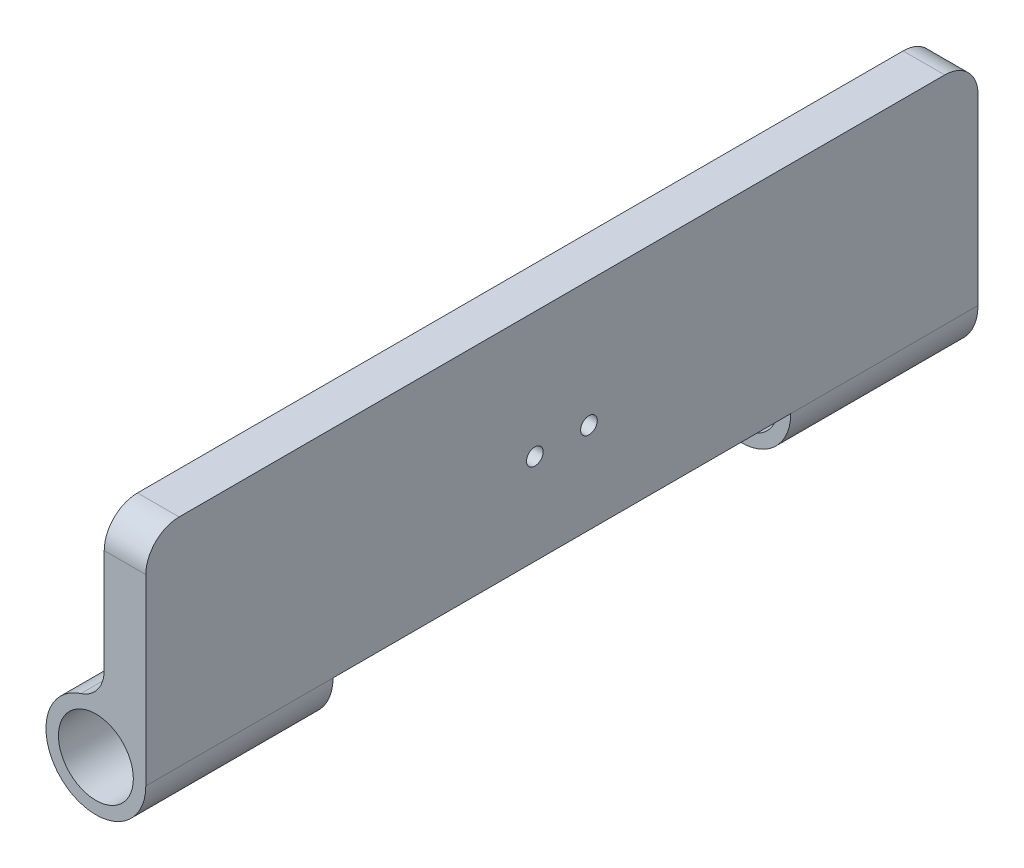
ISO-10303-21;
HEADER;
FILE_DESCRIPTION(('STEP AP214'),'2;1');
FILE_NAME('part.step','',(''),(''),'','','');
FILE_SCHEMA(('AUTOMOTIVE_DESIGN { 1 0 10303 214 1 1 1 1 }'));
ENDSEC;
DATA;
#1=APPLICATION_CONTEXT('core data for automotive mechanical design processes');
#2=APPLICATION_PROTOCOL_DEFINITION('international standard','automotive_design',2000,#1);
#3=PRODUCT_CONTEXT('',#1,'mechanical');
#4=PRODUCT('Part','Part','',(#3));
#5=PRODUCT_RELATED_PRODUCT_CATEGORY('part','',(#4));
#6=PRODUCT_DEFINITION_FORMATION('','',#4);
#7=PRODUCT_DEFINITION_CONTEXT('part definition',#1,'design');
#8=PRODUCT_DEFINITION('design','',#6,#7);
#9=PRODUCT_DEFINITION_SHAPE('','',#8);
#10=(LENGTH_UNIT() NAMED_UNIT(*) SI_UNIT(.MILLI.,.METRE.));
#11=(NAMED_UNIT(*) PLANE_ANGLE_UNIT() SI_UNIT($,.RADIAN.));
#12=(NAMED_UNIT(*) SI_UNIT($,.STERADIAN.) SOLID_ANGLE_UNIT());
#13=UNCERTAINTY_MEASURE_WITH_UNIT(LENGTH_MEASURE(1.E-05),#10,'distance_accuracy_value','');
#14=(GEOMETRIC_REPRESENTATION_CONTEXT(3) GLOBAL_UNCERTAINTY_ASSIGNED_CONTEXT((#13)) GLOBAL_UNIT_ASSIGNED_CONTEXT((#10,
#11,#12)) REPRESENTATION_CONTEXT('',''));
#15=CARTESIAN_POINT('',(0.,0.,0.));
#16=DIRECTION('',(0.,0.,1.));
#17=DIRECTION('',(1.,0.,0.));
#18=AXIS2_PLACEMENT_3D('',#15,#16,#17);
#19=CARTESIAN_POINT('',(-1.,40.,-76.4764045897474));
#20=DIRECTION('',(0.,0.,1.));
#21=DIRECTION('',(1.,0.,0.));
#22=AXIS2_PLACEMENT_3D('',#19,#20,#21);
#23=CYLINDRICAL_SURFACE('',#22,6.00000000000001);
#24=DIRECTION('',(0.,0.,1.));
#25=VECTOR('',#24,1.);
#26=CARTESIAN_POINT('',(5.,40.,-76.4764045897474));
#27=LINE('',#26,#25);
#28=CARTESIAN_POINT('',(5.,40.,-27.5));
#29=VERTEX_POINT('',#28);
#30=CARTESIAN_POINT('',(5.,40.,27.5));
#31=VERTEX_POINT('',#30);
#32=EDGE_CURVE('E155',#29,#31,#27,.T.);
#33=ORIENTED_EDGE('',*,*,#32,.T.);
#34=CARTESIAN_POINT('',(-1.,40.,27.5));
#35=DIRECTION('',(0.,0.,1.));
#36=DIRECTION('',(1.,0.,0.));
#37=AXIS2_PLACEMENT_3D('',#34,#35,#36);
#38=CIRCLE('',#37,6.);
#39=CARTESIAN_POINT('',(0.,45.9160797830996,27.5));
#40=VERTEX_POINT('',#39);
#41=EDGE_CURVE('E140',#31,#40,#38,.T.);
#42=ORIENTED_EDGE('',*,*,#41,.T.);
#43=DIRECTION('',(0.,0.,1.));
#44=VECTOR('',#43,1.);
#45=CARTESIAN_POINT('',(0.,45.9160797830996,-76.4764045897474));
#46=LINE('',#45,#44);
#47=CARTESIAN_POINT('',(0.,45.9160797830996,-27.5));
#48=VERTEX_POINT('',#47);
#49=EDGE_CURVE('E267',#48,#40,#46,.T.);
#50=ORIENTED_EDGE('',*,*,#49,.F.);
#51=CARTESIAN_POINT('',(-1.,40.,-27.5));
#52=DIRECTION('',(0.,0.,1.));
#53=DIRECTION('',(1.,0.,0.));
#54=AXIS2_PLACEMENT_3D('',#51,#52,#53);
#55=CIRCLE('',#54,6.);
#56=EDGE_CURVE('E164',#29,#48,#55,.T.);
#57=ORIENTED_EDGE('',*,*,#56,.F.);
#58=EDGE_LOOP('',(#33,#42,#50,#57));
#59=FACE_BOUND('',#58,.T.);
#60=ADVANCED_FACE('F45',(#59),#23,.F.);
#61=CARTESIAN_POINT('',(-1.,40.,50.));
#62=DIRECTION('',(0.,0.,-1.));
#63=DIRECTION('',(-1.,0.,0.));
#64=AXIS2_PLACEMENT_3D('',#61,#62,#63);
#65=CYLINDRICAL_SURFACE('',#64,6.);
#66=CARTESIAN_POINT('',(-2.8,45.7236352085017,-27.5));
#67=VERTEX_POINT('',#66);
#68=EDGE_CURVE('E190',#67,#29,#55,.T.);
#69=ORIENTED_EDGE('',*,*,#68,.F.);
#70=DIRECTION('',(0.,0.,-1.));
#71=VECTOR('',#70,1.);
#72=CARTESIAN_POINT('',(-2.8,45.7236352085017,50.));
#73=LINE('',#72,#71);
#74=CARTESIAN_POINT('',(-2.8,45.7236352085017,-50.));
#75=VERTEX_POINT('',#74);
#76=EDGE_CURVE('E217',#67,#75,#73,.T.);
#77=ORIENTED_EDGE('',*,*,#76,.T.);
#78=CARTESIAN_POINT('',(-1.,40.,-50.));
#79=DIRECTION('',(0.,0.,1.));
#80=DIRECTION('',(1.,0.,0.));
#81=AXIS2_PLACEMENT_3D('',#78,#79,#80);
#82=CIRCLE('',#81,6.);
#83=CARTESIAN_POINT('',(5.,40.,-50.));
#84=VERTEX_POINT('',#83);
#85=EDGE_CURVE('E180',#75,#84,#82,.T.);
#86=ORIENTED_EDGE('',*,*,#85,.T.);
#87=EDGE_CURVE('E166',#84,#29,#27,.T.);
#88=ORIENTED_EDGE('',*,*,#87,.T.);
#89=EDGE_LOOP('',(#69,#77,#86,#88));
#90=FACE_BOUND('',#89,.T.);
#91=ADVANCED_FACE('F252',(#90),#65,.T.);
#92=CARTESIAN_POINT('',(-1.,40.,50.));
#93=DIRECTION('',(0.,0.,-1.));
#94=DIRECTION('',(-1.,0.,0.));
#95=AXIS2_PLACEMENT_3D('',#92,#93,#94);
#96=CYLINDRICAL_SURFACE('',#95,4.5);
#97=CARTESIAN_POINT('',(-1.,40.,-50.));
#98=DIRECTION('',(0.,0.,1.));
#99=DIRECTION('',(1.,0.,0.));
#100=AXIS2_PLACEMENT_3D('',#97,#98,#99);
#101=CIRCLE('',#100,4.5);
#102=CARTESIAN_POINT('',(3.5,40.,-50.));
#103=VERTEX_POINT('',#102);
#104=EDGE_CURVE('E186',#103,#103,#101,.T.);
#105=ORIENTED_EDGE('',*,*,#104,.F.);
#106=EDGE_LOOP('',(#105));
#107=FACE_BOUND('',#106,.T.);
#108=CARTESIAN_POINT('',(-1.,40.,-27.5));
#109=DIRECTION('',(0.,0.,1.));
#110=DIRECTION('',(1.,0.,0.));
#111=AXIS2_PLACEMENT_3D('',#108,#109,#110);
#112=CIRCLE('',#111,4.5);
#113=CARTESIAN_POINT('',(3.5,40.,-27.5));
#114=VERTEX_POINT('',#113);
#115=EDGE_CURVE('E185',#114,#114,#112,.T.);
#116=ORIENTED_EDGE('',*,*,#115,.T.);
#117=EDGE_LOOP('',(#116));
#118=FACE_BOUND('',#117,.T.);
#119=ADVANCED_FACE('F350',(#107,#118),#96,.F.);
#120=CARTESIAN_POINT('',(-1.,40.,-50.));
#121=DIRECTION('',(0.,0.,1.));
#122=DIRECTION('',(1.,0.,0.));
#123=AXIS2_PLACEMENT_3D('',#120,#121,#122);
#124=PLANE('',#123);
#125=DIRECTION('',(0.,1.,0.));
#126=VECTOR('',#125,1.);
#127=CARTESIAN_POINT('',(0.,45.9160797830996,-50.));
#128=LINE('',#127,#126);
#129=CARTESIAN_POINT('',(0.,49.5393920141695,-50.));
#130=VERTEX_POINT('',#129);
#131=CARTESIAN_POINT('',(0.,62.,-50.));
#132=VERTEX_POINT('',#131);
#133=EDGE_CURVE('E181',#130,#132,#128,.T.);
#134=ORIENTED_EDGE('',*,*,#133,.T.);
#135=DIRECTION('',(1.,0.,0.));
#136=VECTOR('',#135,1.);
#137=CARTESIAN_POINT('',(5.,62.,-50.));
#138=LINE('',#137,#136);
#139=CARTESIAN_POINT('',(5.,62.,-50.));
#140=VERTEX_POINT('',#139);
#141=EDGE_CURVE('E235',#132,#140,#138,.T.);
#142=ORIENTED_EDGE('',*,*,#141,.T.);
#143=DIRECTION('',(0.,-1.,0.));
#144=VECTOR('',#143,1.);
#145=CARTESIAN_POINT('',(5.,40.,-50.));
#146=LINE('',#145,#144);
#147=EDGE_CURVE('E177',#140,#84,#146,.T.);
#148=ORIENTED_EDGE('',*,*,#147,.T.);
#149=ORIENTED_EDGE('',*,*,#85,.F.);
#150=CARTESIAN_POINT('',(-4.,49.5393920141695,-50.));
#151=DIRECTION('',(0.,0.,1.));
#152=DIRECTION('',(1.,0.,0.));
#153=AXIS2_PLACEMENT_3D('',#150,#151,#152);
#154=CIRCLE('',#153,4.);
#155=EDGE_CURVE('E11',#75,#130,#154,.T.);
#156=ORIENTED_EDGE('',*,*,#155,.T.);
#157=EDGE_LOOP('',(#134,#142,#148,#149,#156));
#158=FACE_BOUND('',#157,.T.);
#159=ORIENTED_EDGE('',*,*,#104,.T.);
#160=EDGE_LOOP('',(#159));
#161=FACE_BOUND('',#160,.T.);
#162=ADVANCED_FACE('F260',(#158,#161),#124,.F.);
#163=CARTESIAN_POINT('',(-1.,40.,-27.5));
#164=DIRECTION('',(0.,0.,1.));
#165=DIRECTION('',(1.,0.,0.));
#166=AXIS2_PLACEMENT_3D('',#163,#164,#165);
#167=PLANE('',#166);
#168=ORIENTED_EDGE('',*,*,#115,.F.);
#169=EDGE_LOOP('',(#168));
#170=FACE_BOUND('',#169,.T.);
#171=ORIENTED_EDGE('',*,*,#56,.T.);
#172=DIRECTION('',(0.,-1.,0.));
#173=VECTOR('',#172,1.);
#174=CARTESIAN_POINT('',(0.,40.,-27.5));
#175=LINE('',#174,#173);
#176=CARTESIAN_POINT('',(0.,49.5393920141695,-27.5));
#177=VERTEX_POINT('',#176);
#178=EDGE_CURVE('E202',#177,#48,#175,.T.);
#179=ORIENTED_EDGE('',*,*,#178,.F.);
#180=CARTESIAN_POINT('',(-4.,49.5393920141695,-27.5));
#181=DIRECTION('',(0.,0.,1.));
#182=DIRECTION('',(1.,0.,0.));
#183=AXIS2_PLACEMENT_3D('',#180,#181,#182);
#184=CIRCLE('',#183,4.);
#185=EDGE_CURVE('E54',#177,#67,#184,.F.);
#186=ORIENTED_EDGE('',*,*,#185,.T.);
#187=ORIENTED_EDGE('',*,*,#68,.T.);
#188=EDGE_LOOP('',(#171,#179,#186,#187));
#189=FACE_BOUND('',#188,.T.);
#190=ADVANCED_FACE('F247',(#170,#189),#167,.T.);
#191=CARTESIAN_POINT('',(0.,45.9160797830996,-76.4764045897474));
#192=DIRECTION('',(-1.,0.,0.));
#193=DIRECTION('',(0.,0.,1.));
#194=AXIS2_PLACEMENT_3D('',#191,#192,#193);
#195=PLANE('',#194);
#196=CARTESIAN_POINT('',(0.,50.9160797830996,3.24999999999999));
#197=DIRECTION('',(-1.,0.,0.));
#198=DIRECTION('',(0.,0.,1.));
#199=AXIS2_PLACEMENT_3D('',#196,#197,#198);
#200=CIRCLE('',#199,0.999999999999998);
#201=CARTESIAN_POINT('',(0.,50.9160797830996,4.24999999999999));
#202=VERTEX_POINT('',#201);
#203=EDGE_CURVE('E310',#202,#202,#200,.T.);
#204=ORIENTED_EDGE('',*,*,#203,.F.);
#205=EDGE_LOOP('',(#204));
#206=FACE_BOUND('',#205,.T.);
#207=CARTESIAN_POINT('',(0.,50.9160797830996,-3.25));
#208=DIRECTION('',(-1.,0.,0.));
#209=DIRECTION('',(0.,0.,1.));
#210=AXIS2_PLACEMENT_3D('',#207,#208,#209);
#211=CIRCLE('',#210,0.999999999999998);
#212=CARTESIAN_POINT('',(0.,50.9160797830996,-2.25000000000001));
#213=VERTEX_POINT('',#212);
#214=EDGE_CURVE('E306',#213,#213,#211,.T.);
#215=ORIENTED_EDGE('',*,*,#214,.F.);
#216=EDGE_LOOP('',(#215));
#217=FACE_BOUND('',#216,.T.);
#218=DIRECTION('',(0.,1.,0.));
#219=VECTOR('',#218,1.);
#220=CARTESIAN_POINT('',(0.,45.9160797830996,27.5));
#221=LINE('',#220,#219);
#222=CARTESIAN_POINT('',(0.,49.5393920141695,27.5));
#223=VERTEX_POINT('',#222);
#224=EDGE_CURVE('E61',#40,#223,#221,.T.);
#225=ORIENTED_EDGE('',*,*,#224,.T.);
#226=DIRECTION('',(0.,0.,-1.));
#227=VECTOR('',#226,1.);
#228=CARTESIAN_POINT('',(0.,49.5393920141695,-76.4764045897474));
#229=LINE('',#228,#227);
#230=CARTESIAN_POINT('',(0.,49.5393920141695,50.));
#231=VERTEX_POINT('',#230);
#232=EDGE_CURVE('E211',#223,#231,#229,.F.);
#233=ORIENTED_EDGE('',*,*,#232,.T.);
#234=DIRECTION('',(0.,-1.,0.));
#235=VECTOR('',#234,1.);
#236=CARTESIAN_POINT('',(0.,45.9160797830996,50.));
#237=LINE('',#236,#235);
#238=CARTESIAN_POINT('',(0.,62.,50.));
#239=VERTEX_POINT('',#238);
#240=EDGE_CURVE('E167',#239,#231,#237,.T.);
#241=ORIENTED_EDGE('',*,*,#240,.F.);
#242=CARTESIAN_POINT('',(0.,62.,46.));
#243=DIRECTION('',(-1.,0.,0.));
#244=DIRECTION('',(0.,0.,1.));
#245=AXIS2_PLACEMENT_3D('',#242,#243,#244);
#246=CIRCLE('',#245,4.);
#247=CARTESIAN_POINT('',(0.,66.,46.));
#248=VERTEX_POINT('',#247);
#249=EDGE_CURVE('E199',#239,#248,#246,.T.);
#250=ORIENTED_EDGE('',*,*,#249,.T.);
#251=DIRECTION('',(0.,0.,1.));
#252=VECTOR('',#251,1.);
#253=CARTESIAN_POINT('',(0.,66.,-76.4764045897474));
#254=LINE('',#253,#252);
#255=CARTESIAN_POINT('',(0.,66.,-46.));
#256=VERTEX_POINT('',#255);
#257=EDGE_CURVE('E270',#256,#248,#254,.T.);
#258=ORIENTED_EDGE('',*,*,#257,.F.);
#259=CARTESIAN_POINT('',(0.,62.,-46.));
#260=DIRECTION('',(-1.,0.,0.));
#261=DIRECTION('',(0.,0.,1.));
#262=AXIS2_PLACEMENT_3D('',#259,#260,#261);
#263=CIRCLE('',#262,4.);
#264=EDGE_CURVE('E193',#256,#132,#263,.T.);
#265=ORIENTED_EDGE('',*,*,#264,.T.);
#266=ORIENTED_EDGE('',*,*,#133,.F.);
#267=DIRECTION('',(0.,0.,-1.));
#268=VECTOR('',#267,1.);
#269=CARTESIAN_POINT('',(0.,49.5393920141695,-76.4764045897474));
#270=LINE('',#269,#268);
#271=EDGE_CURVE('E205',#130,#177,#270,.F.);
#272=ORIENTED_EDGE('',*,*,#271,.T.);
#273=ORIENTED_EDGE('',*,*,#178,.T.);
#274=ORIENTED_EDGE('',*,*,#49,.T.);
#275=EDGE_LOOP('',(#225,#233,#241,#250,#258,#265,#266,#272,#273,#274));
#276=FACE_BOUND('',#275,.T.);
#277=ADVANCED_FACE('F263',(#206,#217,#276),#195,.T.);
#278=CARTESIAN_POINT('',(5.,66.,-76.4764045897474));
#279=DIRECTION('',(0.,1.,0.));
#280=DIRECTION('',(0.,0.,1.));
#281=AXIS2_PLACEMENT_3D('',#278,#279,#280);
#282=PLANE('',#281);
#283=ORIENTED_EDGE('',*,*,#257,.T.);
#284=DIRECTION('',(-1.,0.,0.));
#285=VECTOR('',#284,1.);
#286=CARTESIAN_POINT('',(5.,66.,46.));
#287=LINE('',#286,#285);
#288=CARTESIAN_POINT('',(5.,66.,46.));
#289=VERTEX_POINT('',#288);
#290=EDGE_CURVE('E227',#248,#289,#287,.F.);
#291=ORIENTED_EDGE('',*,*,#290,.T.);
#292=DIRECTION('',(0.,0.,1.));
#293=VECTOR('',#292,1.);
#294=CARTESIAN_POINT('',(5.,66.,-76.4764045897474));
#295=LINE('',#294,#293);
#296=CARTESIAN_POINT('',(5.,66.,-46.));
#297=VERTEX_POINT('',#296);
#298=EDGE_CURVE('E171',#297,#289,#295,.T.);
#299=ORIENTED_EDGE('',*,*,#298,.F.);
#300=DIRECTION('',(1.,0.,0.));
#301=VECTOR('',#300,1.);
#302=CARTESIAN_POINT('',(0.,66.,-46.));
#303=LINE('',#302,#301);
#304=EDGE_CURVE('E224',#297,#256,#303,.F.);
#305=ORIENTED_EDGE('',*,*,#304,.T.);
#306=EDGE_LOOP('',(#283,#291,#299,#305));
#307=FACE_BOUND('',#306,.T.);
#308=ADVANCED_FACE('F329',(#307),#282,.T.);
#309=CARTESIAN_POINT('',(5.,40.,-76.4764045897474));
#310=DIRECTION('',(1.,0.,0.));
#311=DIRECTION('',(0.,1.,0.));
#312=AXIS2_PLACEMENT_3D('',#309,#310,#311);
#313=PLANE('',#312);
#314=CARTESIAN_POINT('',(5.,50.9160797830996,3.24999999999999));
#315=DIRECTION('',(-1.,0.,0.));
#316=DIRECTION('',(0.,0.,1.));
#317=AXIS2_PLACEMENT_3D('',#314,#315,#316);
#318=CIRCLE('',#317,0.999999999999998);
#319=CARTESIAN_POINT('',(5.,50.9160797830996,4.24999999999999));
#320=VERTEX_POINT('',#319);
#321=EDGE_CURVE('E301',#320,#320,#318,.T.);
#322=ORIENTED_EDGE('',*,*,#321,.T.);
#323=EDGE_LOOP('',(#322));
#324=FACE_BOUND('',#323,.T.);
#325=CARTESIAN_POINT('',(5.,50.9160797830996,-3.25));
#326=DIRECTION('',(-1.,0.,0.));
#327=DIRECTION('',(0.,0.,1.));
#328=AXIS2_PLACEMENT_3D('',#325,#326,#327);
#329=CIRCLE('',#328,0.999999999999998);
#330=CARTESIAN_POINT('',(5.,50.9160797830996,-2.25000000000001));
#331=VERTEX_POINT('',#330);
#332=EDGE_CURVE('E302',#331,#331,#329,.T.);
#333=ORIENTED_EDGE('',*,*,#332,.T.);
#334=EDGE_LOOP('',(#333));
#335=FACE_BOUND('',#334,.T.);
#336=ORIENTED_EDGE('',*,*,#298,.T.);
#337=CARTESIAN_POINT('',(5.,62.,46.));
#338=DIRECTION('',(1.,0.,0.));
#339=DIRECTION('',(0.,1.,0.));
#340=AXIS2_PLACEMENT_3D('',#337,#338,#339);
#341=CIRCLE('',#340,4.);
#342=CARTESIAN_POINT('',(5.,62.,50.));
#343=VERTEX_POINT('',#342);
#344=EDGE_CURVE('E232',#289,#343,#341,.T.);
#345=ORIENTED_EDGE('',*,*,#344,.T.);
#346=DIRECTION('',(0.,1.,0.));
#347=VECTOR('',#346,1.);
#348=CARTESIAN_POINT('',(5.,40.,50.));
#349=LINE('',#348,#347);
#350=CARTESIAN_POINT('',(5.,40.,50.));
#351=VERTEX_POINT('',#350);
#352=EDGE_CURVE('E158',#351,#343,#349,.T.);
#353=ORIENTED_EDGE('',*,*,#352,.F.);
#354=DIRECTION('',(0.,0.,-1.));
#355=VECTOR('',#354,1.);
#356=CARTESIAN_POINT('',(5.,40.,50.));
#357=LINE('',#356,#355);
#358=EDGE_CURVE('E134',#31,#351,#357,.F.);
#359=ORIENTED_EDGE('',*,*,#358,.F.);
#360=ORIENTED_EDGE('',*,*,#32,.F.);
#361=ORIENTED_EDGE('',*,*,#87,.F.);
#362=ORIENTED_EDGE('',*,*,#147,.F.);
#363=CARTESIAN_POINT('',(5.,62.,-46.));
#364=DIRECTION('',(1.,0.,0.));
#365=DIRECTION('',(0.,1.,0.));
#366=AXIS2_PLACEMENT_3D('',#363,#364,#365);
#367=CIRCLE('',#366,4.);
#368=EDGE_CURVE('E69',#140,#297,#367,.T.);
#369=ORIENTED_EDGE('',*,*,#368,.T.);
#370=EDGE_LOOP('',(#336,#345,#353,#359,#360,#361,#362,#369));
#371=FACE_BOUND('',#370,.T.);
#372=ADVANCED_FACE('F153',(#324,#335,#371),#313,.T.);
#373=CARTESIAN_POINT('',(-1.,40.,50.));
#374=DIRECTION('',(0.,0.,1.));
#375=DIRECTION('',(1.,0.,0.));
#376=AXIS2_PLACEMENT_3D('',#373,#374,#375);
#377=PLANE('',#376);
#378=ORIENTED_EDGE('',*,*,#352,.T.);
#379=DIRECTION('',(-1.,0.,0.));
#380=VECTOR('',#379,1.);
#381=CARTESIAN_POINT('',(-1.,62.,50.));
#382=LINE('',#381,#380);
#383=EDGE_CURVE('E220',#343,#239,#382,.T.);
#384=ORIENTED_EDGE('',*,*,#383,.T.);
#385=ORIENTED_EDGE('',*,*,#240,.T.);
#386=CARTESIAN_POINT('',(-4.,49.5393920141695,50.));
#387=DIRECTION('',(0.,0.,1.));
#388=DIRECTION('',(1.,0.,0.));
#389=AXIS2_PLACEMENT_3D('',#386,#387,#388);
#390=CIRCLE('',#389,4.);
#391=CARTESIAN_POINT('',(-2.8,45.7236352085017,50.));
#392=VERTEX_POINT('',#391);
#393=EDGE_CURVE('E238',#231,#392,#390,.F.);
#394=ORIENTED_EDGE('',*,*,#393,.T.);
#395=CARTESIAN_POINT('',(-1.,40.,50.));
#396=DIRECTION('',(0.,0.,1.));
#397=DIRECTION('',(1.,0.,0.));
#398=AXIS2_PLACEMENT_3D('',#395,#396,#397);
#399=CIRCLE('',#398,6.);
#400=EDGE_CURVE('E160',#392,#351,#399,.T.);
#401=ORIENTED_EDGE('',*,*,#400,.T.);
#402=EDGE_LOOP('',(#378,#384,#385,#394,#401));
#403=FACE_BOUND('',#402,.T.);
#404=CARTESIAN_POINT('',(-1.,40.,50.));
#405=DIRECTION('',(0.,0.,1.));
#406=DIRECTION('',(1.,0.,0.));
#407=AXIS2_PLACEMENT_3D('',#404,#405,#406);
#408=CIRCLE('',#407,4.5);
#409=CARTESIAN_POINT('',(3.5,40.,50.));
#410=VERTEX_POINT('',#409);
#411=EDGE_CURVE('E149',#410,#410,#408,.T.);
#412=ORIENTED_EDGE('',*,*,#411,.F.);
#413=EDGE_LOOP('',(#412));
#414=FACE_BOUND('',#413,.T.);
#415=ADVANCED_FACE('F288',(#403,#414),#377,.T.);
#416=CARTESIAN_POINT('',(-1.,40.,50.));
#417=DIRECTION('',(0.,0.,-1.));
#418=DIRECTION('',(-1.,0.,0.));
#419=AXIS2_PLACEMENT_3D('',#416,#417,#418);
#420=CYLINDRICAL_SURFACE('',#419,6.);
#421=ORIENTED_EDGE('',*,*,#400,.F.);
#422=DIRECTION('',(0.,0.,-1.));
#423=VECTOR('',#422,1.);
#424=CARTESIAN_POINT('',(-2.8,45.7236352085017,50.));
#425=LINE('',#424,#423);
#426=CARTESIAN_POINT('',(-2.8,45.7236352085017,27.5));
#427=VERTEX_POINT('',#426);
#428=EDGE_CURVE('E137',#392,#427,#425,.T.);
#429=ORIENTED_EDGE('',*,*,#428,.T.);
#430=EDGE_CURVE('E130',#427,#31,#38,.T.);
#431=ORIENTED_EDGE('',*,*,#430,.T.);
#432=ORIENTED_EDGE('',*,*,#358,.T.);
#433=EDGE_LOOP('',(#421,#429,#431,#432));
#434=FACE_BOUND('',#433,.T.);
#435=ADVANCED_FACE('F132',(#434),#420,.T.);
#436=CARTESIAN_POINT('',(-1.,40.,50.));
#437=DIRECTION('',(0.,0.,-1.));
#438=DIRECTION('',(-1.,0.,0.));
#439=AXIS2_PLACEMENT_3D('',#436,#437,#438);
#440=CYLINDRICAL_SURFACE('',#439,4.5);
#441=CARTESIAN_POINT('',(-1.,40.,27.5));
#442=DIRECTION('',(0.,0.,1.));
#443=DIRECTION('',(1.,0.,0.));
#444=AXIS2_PLACEMENT_3D('',#441,#442,#443);
#445=CIRCLE('',#444,4.5);
#446=CARTESIAN_POINT('',(3.5,40.,27.5));
#447=VERTEX_POINT('',#446);
#448=EDGE_CURVE('E141',#447,#447,#445,.T.);
#449=ORIENTED_EDGE('',*,*,#448,.F.);
#450=EDGE_LOOP('',(#449));
#451=FACE_BOUND('',#450,.T.);
#452=ORIENTED_EDGE('',*,*,#411,.T.);
#453=EDGE_LOOP('',(#452));
#454=FACE_BOUND('',#453,.T.);
#455=ADVANCED_FACE('F340',(#451,#454),#440,.F.);
#456=CARTESIAN_POINT('',(-1.,40.,27.5));
#457=DIRECTION('',(0.,0.,1.));
#458=DIRECTION('',(1.,0.,0.));
#459=AXIS2_PLACEMENT_3D('',#456,#457,#458);
#460=PLANE('',#459);
#461=ORIENTED_EDGE('',*,*,#448,.T.);
#462=EDGE_LOOP('',(#461));
#463=FACE_BOUND('',#462,.T.);
#464=ORIENTED_EDGE('',*,*,#41,.F.);
#465=ORIENTED_EDGE('',*,*,#430,.F.);
#466=CARTESIAN_POINT('',(-4.,49.5393920141695,27.5));
#467=DIRECTION('',(0.,0.,1.));
#468=DIRECTION('',(1.,0.,0.));
#469=AXIS2_PLACEMENT_3D('',#466,#467,#468);
#470=CIRCLE('',#469,4.);
#471=EDGE_CURVE('E241',#427,#223,#470,.T.);
#472=ORIENTED_EDGE('',*,*,#471,.T.);
#473=ORIENTED_EDGE('',*,*,#224,.F.);
#474=EDGE_LOOP('',(#464,#465,#472,#473));
#475=FACE_BOUND('',#474,.T.);
#476=ADVANCED_FACE('F144',(#463,#475),#460,.F.);
#477=CARTESIAN_POINT('',(5.,50.9160797830996,-3.25));
#478=DIRECTION('',(-1.,0.,0.));
#479=DIRECTION('',(0.,0.,1.));
#480=AXIS2_PLACEMENT_3D('',#477,#478,#479);
#481=CYLINDRICAL_SURFACE('',#480,0.999999999999998);
#482=ORIENTED_EDGE('',*,*,#332,.F.);
#483=EDGE_LOOP('',(#482));
#484=FACE_BOUND('',#483,.T.);
#485=ORIENTED_EDGE('',*,*,#214,.T.);
#486=EDGE_LOOP('',(#485));
#487=FACE_BOUND('',#486,.T.);
#488=ADVANCED_FACE('F323',(#484,#487),#481,.F.);
#489=CARTESIAN_POINT('',(5.,50.9160797830996,3.24999999999999));
#490=DIRECTION('',(-1.,0.,0.));
#491=DIRECTION('',(0.,0.,1.));
#492=AXIS2_PLACEMENT_3D('',#489,#490,#491);
#493=CYLINDRICAL_SURFACE('',#492,0.999999999999998);
#494=ORIENTED_EDGE('',*,*,#321,.F.);
#495=EDGE_LOOP('',(#494));
#496=FACE_BOUND('',#495,.T.);
#497=ORIENTED_EDGE('',*,*,#203,.T.);
#498=EDGE_LOOP('',(#497));
#499=FACE_BOUND('',#498,.T.);
#500=ADVANCED_FACE('F320',(#496,#499),#493,.F.);
#501=CARTESIAN_POINT('',(-4.,49.5393920141695,50.));
#502=DIRECTION('',(0.,0.,-1.));
#503=DIRECTION('',(-1.,0.,0.));
#504=AXIS2_PLACEMENT_3D('',#501,#502,#503);
#505=CYLINDRICAL_SURFACE('',#504,4.);
#506=ORIENTED_EDGE('',*,*,#471,.F.);
#507=ORIENTED_EDGE('',*,*,#428,.F.);
#508=ORIENTED_EDGE('',*,*,#393,.F.);
#509=ORIENTED_EDGE('',*,*,#232,.F.);
#510=EDGE_LOOP('',(#506,#507,#508,#509));
#511=FACE_BOUND('',#510,.T.);
#512=ADVANCED_FACE('F292',(#511),#505,.F.);
#513=CARTESIAN_POINT('',(-4.,49.5393920141695,50.));
#514=DIRECTION('',(0.,0.,-1.));
#515=DIRECTION('',(-1.,0.,0.));
#516=AXIS2_PLACEMENT_3D('',#513,#514,#515);
#517=CYLINDRICAL_SURFACE('',#516,4.);
#518=ORIENTED_EDGE('',*,*,#155,.F.);
#519=ORIENTED_EDGE('',*,*,#76,.F.);
#520=ORIENTED_EDGE('',*,*,#185,.F.);
#521=ORIENTED_EDGE('',*,*,#271,.F.);
#522=EDGE_LOOP('',(#518,#519,#520,#521));
#523=FACE_BOUND('',#522,.T.);
#524=ADVANCED_FACE('F256',(#523),#517,.F.);
#525=CARTESIAN_POINT('',(-1.,62.,46.));
#526=DIRECTION('',(-1.,0.,0.));
#527=DIRECTION('',(0.,0.,1.));
#528=AXIS2_PLACEMENT_3D('',#525,#526,#527);
#529=CYLINDRICAL_SURFACE('',#528,4.);
#530=ORIENTED_EDGE('',*,*,#344,.F.);
#531=ORIENTED_EDGE('',*,*,#290,.F.);
#532=ORIENTED_EDGE('',*,*,#249,.F.);
#533=ORIENTED_EDGE('',*,*,#383,.F.);
#534=EDGE_LOOP('',(#530,#531,#532,#533));
#535=FACE_BOUND('',#534,.T.);
#536=ADVANCED_FACE('F285',(#535),#529,.T.);
#537=CARTESIAN_POINT('',(-1.,62.,-46.));
#538=DIRECTION('',(-1.,0.,0.));
#539=DIRECTION('',(0.,0.,1.));
#540=AXIS2_PLACEMENT_3D('',#537,#538,#539);
#541=CYLINDRICAL_SURFACE('',#540,4.);
#542=ORIENTED_EDGE('',*,*,#264,.F.);
#543=ORIENTED_EDGE('',*,*,#304,.F.);
#544=ORIENTED_EDGE('',*,*,#368,.F.);
#545=ORIENTED_EDGE('',*,*,#141,.F.);
#546=EDGE_LOOP('',(#542,#543,#544,#545));
#547=FACE_BOUND('',#546,.T.);
#548=ADVANCED_FACE('F47',(#547),#541,.T.);
#549=CLOSED_SHELL('',(#60,#91,#119,#162,#190,#277,#308,#372,#415,#435,#455,#476,#488,#500,#512,
#524,#536,#548));
#550=MANIFOLD_SOLID_BREP('B2',#549);
#551=ADVANCED_BREP_SHAPE_REPRESENTATION('',(#18,#550),#14);
#552=SHAPE_DEFINITION_REPRESENTATION(#9,#551);
ENDSEC;
END-ISO-10303-21;
